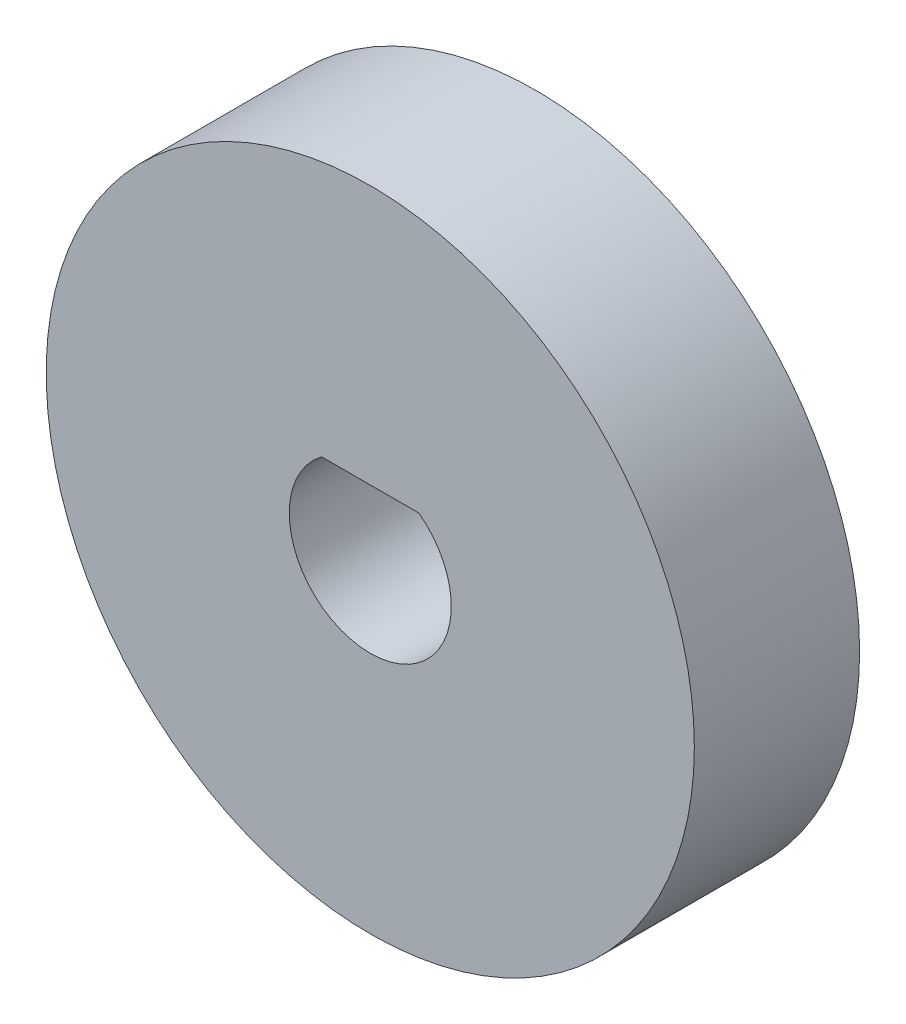
ISO-10303-21;
HEADER;
FILE_DESCRIPTION(('STEP AP214'),'2;1');
FILE_NAME('part.step','',(''),(''),'','','');
FILE_SCHEMA(('AUTOMOTIVE_DESIGN { 1 0 10303 214 1 1 1 1 }'));
ENDSEC;
DATA;
#1=APPLICATION_CONTEXT('core data for automotive mechanical design processes');
#2=APPLICATION_PROTOCOL_DEFINITION('international standard','automotive_design',2000,#1);
#3=PRODUCT_CONTEXT('',#1,'mechanical');
#4=PRODUCT('Part','Part','',(#3));
#5=PRODUCT_RELATED_PRODUCT_CATEGORY('part','',(#4));
#6=PRODUCT_DEFINITION_FORMATION('','',#4);
#7=PRODUCT_DEFINITION_CONTEXT('part definition',#1,'design');
#8=PRODUCT_DEFINITION('design','',#6,#7);
#9=PRODUCT_DEFINITION_SHAPE('','',#8);
#10=(LENGTH_UNIT() NAMED_UNIT(*) SI_UNIT(.MILLI.,.METRE.));
#11=(NAMED_UNIT(*) PLANE_ANGLE_UNIT() SI_UNIT($,.RADIAN.));
#12=(NAMED_UNIT(*) SI_UNIT($,.STERADIAN.) SOLID_ANGLE_UNIT());
#13=UNCERTAINTY_MEASURE_WITH_UNIT(LENGTH_MEASURE(1.E-05),#10,'distance_accuracy_value','');
#14=(GEOMETRIC_REPRESENTATION_CONTEXT(3) GLOBAL_UNCERTAINTY_ASSIGNED_CONTEXT((#13)) GLOBAL_UNIT_ASSIGNED_CONTEXT((#10,
#11,#12)) REPRESENTATION_CONTEXT('',''));
#15=CARTESIAN_POINT('',(0.,0.,0.));
#16=DIRECTION('',(0.,0.,1.));
#17=DIRECTION('',(1.,0.,0.));
#18=AXIS2_PLACEMENT_3D('',#15,#16,#17);
#19=CARTESIAN_POINT('',(0.,0.,5.1));
#20=DIRECTION('',(0.,0.,1.));
#21=DIRECTION('',(1.,0.,0.));
#22=AXIS2_PLACEMENT_3D('',#19,#20,#21);
#23=PLANE('',#22);
#24=CARTESIAN_POINT('',(0.,0.,5.1));
#25=DIRECTION('',(0.,0.,1.));
#26=DIRECTION('',(1.,0.,0.));
#27=AXIS2_PLACEMENT_3D('',#24,#25,#26);
#28=CIRCLE('',#27,10.);
#29=CARTESIAN_POINT('',(10.,0.,5.1));
#30=VERTEX_POINT('',#29);
#31=EDGE_CURVE('E11',#30,#30,#28,.T.);
#32=ORIENTED_EDGE('',*,*,#31,.T.);
#33=EDGE_LOOP('',(#32));
#34=FACE_BOUND('',#33,.T.);
#35=DIRECTION('',(-1.,0.,0.));
#36=VECTOR('',#35,1.);
#37=CARTESIAN_POINT('',(-1.5,2.,5.1));
#38=LINE('',#37,#36);
#39=CARTESIAN_POINT('',(1.5,2.,5.1));
#40=VERTEX_POINT('',#39);
#41=CARTESIAN_POINT('',(-1.5,2.,5.1));
#42=VERTEX_POINT('',#41);
#43=EDGE_CURVE('E74',#40,#42,#38,.T.);
#44=ORIENTED_EDGE('',*,*,#43,.F.);
#45=CARTESIAN_POINT('',(0.,0.,5.1));
#46=DIRECTION('',(0.,0.,1.));
#47=DIRECTION('',(1.,0.,0.));
#48=AXIS2_PLACEMENT_3D('',#45,#46,#47);
#49=CIRCLE('',#48,2.5);
#50=EDGE_CURVE('E65',#42,#40,#49,.T.);
#51=ORIENTED_EDGE('',*,*,#50,.F.);
#52=EDGE_LOOP('',(#44,#51));
#53=FACE_BOUND('',#52,.T.);
#54=ADVANCED_FACE('F33',(#34,#53),#23,.T.);
#55=CARTESIAN_POINT('',(0.,0.,0.));
#56=DIRECTION('',(0.,0.,1.));
#57=DIRECTION('',(1.,0.,0.));
#58=AXIS2_PLACEMENT_3D('',#55,#56,#57);
#59=PLANE('',#58);
#60=CARTESIAN_POINT('',(0.,0.,0.));
#61=DIRECTION('',(0.,0.,1.));
#62=DIRECTION('',(1.,0.,0.));
#63=AXIS2_PLACEMENT_3D('',#60,#61,#62);
#64=CIRCLE('',#63,10.);
#65=CARTESIAN_POINT('',(10.,0.,0.));
#66=VERTEX_POINT('',#65);
#67=EDGE_CURVE('E37',#66,#66,#64,.T.);
#68=ORIENTED_EDGE('',*,*,#67,.F.);
#69=EDGE_LOOP('',(#68));
#70=FACE_BOUND('',#69,.T.);
#71=CARTESIAN_POINT('',(0.,0.,0.));
#72=DIRECTION('',(0.,0.,1.));
#73=DIRECTION('',(1.,0.,0.));
#74=AXIS2_PLACEMENT_3D('',#71,#72,#73);
#75=CIRCLE('',#74,2.5);
#76=CARTESIAN_POINT('',(-1.5,2.,0.));
#77=VERTEX_POINT('',#76);
#78=CARTESIAN_POINT('',(1.5,2.,0.));
#79=VERTEX_POINT('',#78);
#80=EDGE_CURVE('E55',#77,#79,#75,.T.);
#81=ORIENTED_EDGE('',*,*,#80,.T.);
#82=DIRECTION('',(-1.,0.,0.));
#83=VECTOR('',#82,1.);
#84=CARTESIAN_POINT('',(-1.5,2.,0.));
#85=LINE('',#84,#83);
#86=EDGE_CURVE('E61',#79,#77,#85,.T.);
#87=ORIENTED_EDGE('',*,*,#86,.T.);
#88=EDGE_LOOP('',(#81,#87));
#89=FACE_BOUND('',#88,.T.);
#90=ADVANCED_FACE('F71',(#70,#89),#59,.F.);
#91=CARTESIAN_POINT('',(0.,0.,5.1));
#92=DIRECTION('',(0.,0.,-1.));
#93=DIRECTION('',(-1.,0.,0.));
#94=AXIS2_PLACEMENT_3D('',#91,#92,#93);
#95=CYLINDRICAL_SURFACE('',#94,10.);
#96=ORIENTED_EDGE('',*,*,#31,.F.);
#97=EDGE_LOOP('',(#96));
#98=FACE_BOUND('',#97,.T.);
#99=ORIENTED_EDGE('',*,*,#67,.T.);
#100=EDGE_LOOP('',(#99));
#101=FACE_BOUND('',#100,.T.);
#102=ADVANCED_FACE('F35',(#98,#101),#95,.T.);
#103=CARTESIAN_POINT('',(0.,0.,5.1));
#104=DIRECTION('',(0.,0.,-1.));
#105=DIRECTION('',(-1.,0.,0.));
#106=AXIS2_PLACEMENT_3D('',#103,#104,#105);
#107=CYLINDRICAL_SURFACE('',#106,2.5);
#108=ORIENTED_EDGE('',*,*,#80,.F.);
#109=DIRECTION('',(0.,0.,-1.));
#110=VECTOR('',#109,1.);
#111=CARTESIAN_POINT('',(-1.5,2.,5.1));
#112=LINE('',#111,#110);
#113=EDGE_CURVE('E63',#42,#77,#112,.T.);
#114=ORIENTED_EDGE('',*,*,#113,.F.);
#115=ORIENTED_EDGE('',*,*,#50,.T.);
#116=DIRECTION('',(0.,0.,-1.));
#117=VECTOR('',#116,1.);
#118=CARTESIAN_POINT('',(1.5,2.,5.1));
#119=LINE('',#118,#117);
#120=EDGE_CURVE('E48',#40,#79,#119,.T.);
#121=ORIENTED_EDGE('',*,*,#120,.T.);
#122=EDGE_LOOP('',(#108,#114,#115,#121));
#123=FACE_BOUND('',#122,.T.);
#124=ADVANCED_FACE('F67',(#123),#107,.F.);
#125=CARTESIAN_POINT('',(-1.5,2.,5.1));
#126=DIRECTION('',(0.,-1.,0.));
#127=DIRECTION('',(0.,0.,-1.));
#128=AXIS2_PLACEMENT_3D('',#125,#126,#127);
#129=PLANE('',#128);
#130=ORIENTED_EDGE('',*,*,#86,.F.);
#131=ORIENTED_EDGE('',*,*,#120,.F.);
#132=ORIENTED_EDGE('',*,*,#43,.T.);
#133=ORIENTED_EDGE('',*,*,#113,.T.);
#134=EDGE_LOOP('',(#130,#131,#132,#133));
#135=FACE_BOUND('',#134,.T.);
#136=ADVANCED_FACE('F62',(#135),#129,.T.);
#137=CLOSED_SHELL('',(#54,#90,#102,#124,#136));
#138=MANIFOLD_SOLID_BREP('B2',#137);
#139=ADVANCED_BREP_SHAPE_REPRESENTATION('',(#18,#138),#14);
#140=SHAPE_DEFINITION_REPRESENTATION(#9,#139);
ENDSEC;
END-ISO-10303-21;
